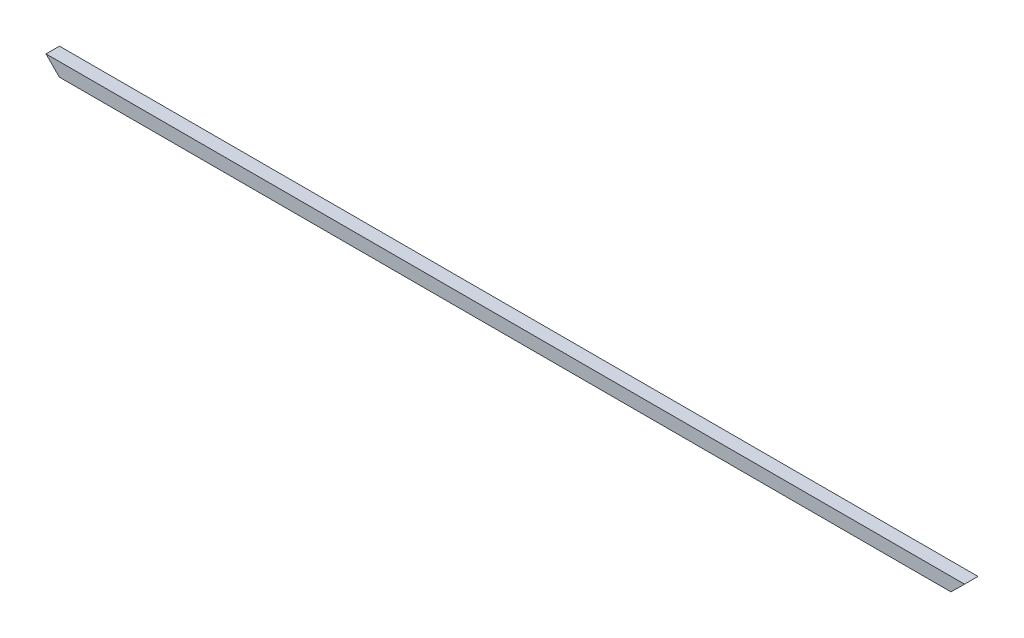
ISO-10303-21;
HEADER;
FILE_DESCRIPTION(('STEP AP214'),'2;1');
FILE_NAME('part.step','',(''),(''),'','','');
FILE_SCHEMA(('AUTOMOTIVE_DESIGN { 1 0 10303 214 1 1 1 1 }'));
ENDSEC;
DATA;
#1=APPLICATION_CONTEXT('core data for automotive mechanical design processes');
#2=APPLICATION_PROTOCOL_DEFINITION('international standard','automotive_design',2000,#1);
#3=PRODUCT_CONTEXT('',#1,'mechanical');
#4=PRODUCT('Part','Part','',(#3));
#5=PRODUCT_RELATED_PRODUCT_CATEGORY('part','',(#4));
#6=PRODUCT_DEFINITION_FORMATION('','',#4);
#7=PRODUCT_DEFINITION_CONTEXT('part definition',#1,'design');
#8=PRODUCT_DEFINITION('design','',#6,#7);
#9=PRODUCT_DEFINITION_SHAPE('','',#8);
#10=(LENGTH_UNIT() NAMED_UNIT(*) SI_UNIT(.MILLI.,.METRE.));
#11=(NAMED_UNIT(*) PLANE_ANGLE_UNIT() SI_UNIT($,.RADIAN.));
#12=(NAMED_UNIT(*) SI_UNIT($,.STERADIAN.) SOLID_ANGLE_UNIT());
#13=UNCERTAINTY_MEASURE_WITH_UNIT(LENGTH_MEASURE(1.E-05),#10,'distance_accuracy_value','');
#14=(GEOMETRIC_REPRESENTATION_CONTEXT(3) GLOBAL_UNCERTAINTY_ASSIGNED_CONTEXT((#13)) GLOBAL_UNIT_ASSIGNED_CONTEXT((#10,
#11,#12)) REPRESENTATION_CONTEXT('',''));
#15=CARTESIAN_POINT('',(0.,0.,0.));
#16=DIRECTION('',(0.,0.,1.));
#17=DIRECTION('',(1.,0.,0.));
#18=AXIS2_PLACEMENT_3D('',#15,#16,#17);
#19=CARTESIAN_POINT('',(-2666.237444967,-40.0000000000003,40.));
#20=DIRECTION('',(0.710799473872985,0.703394702810512,0.));
#21=DIRECTION('',(-0.703394702810512,0.710799473872985,0.));
#22=AXIS2_PLACEMENT_3D('',#19,#20,#21);
#23=PLANE('',#22);
#24=DIRECTION('',(0.703394702810512,-0.710799473872985,0.));
#25=VECTOR('',#24,1.);
#26=CARTESIAN_POINT('',(-2666.237444967,-40.0000000000003,0.));
#27=LINE('',#26,#25);
#28=CARTESIAN_POINT('',(-2705.82074397976,0.,0.));
#29=VERTEX_POINT('',#28);
#30=CARTESIAN_POINT('',(-2666.237444967,-40.0000000000003,0.));
#31=VERTEX_POINT('',#30);
#32=EDGE_CURVE('E99',#29,#31,#27,.T.);
#33=ORIENTED_EDGE('',*,*,#32,.T.);
#34=DIRECTION('',(0.,0.,-1.));
#35=VECTOR('',#34,1.);
#36=CARTESIAN_POINT('',(-2666.237444967,-40.0000000000003,40.));
#37=LINE('',#36,#35);
#38=CARTESIAN_POINT('',(-2666.237444967,-40.0000000000003,40.));
#39=VERTEX_POINT('',#38);
#40=EDGE_CURVE('E11',#39,#31,#37,.T.);
#41=ORIENTED_EDGE('',*,*,#40,.F.);
#42=DIRECTION('',(0.703394702810512,-0.710799473872985,0.));
#43=VECTOR('',#42,1.);
#44=CARTESIAN_POINT('',(-2666.237444967,-40.0000000000003,40.));
#45=LINE('',#44,#43);
#46=CARTESIAN_POINT('',(-2705.82074397976,0.,40.));
#47=VERTEX_POINT('',#46);
#48=EDGE_CURVE('E87',#47,#39,#45,.T.);
#49=ORIENTED_EDGE('',*,*,#48,.F.);
#50=DIRECTION('',(0.,0.,-1.));
#51=VECTOR('',#50,1.);
#52=CARTESIAN_POINT('',(-2705.82074397976,0.,40.));
#53=LINE('',#52,#51);
#54=EDGE_CURVE('E95',#47,#29,#53,.T.);
#55=ORIENTED_EDGE('',*,*,#54,.T.);
#56=EDGE_LOOP('',(#33,#41,#49,#55));
#57=FACE_BOUND('',#56,.T.);
#58=ADVANCED_FACE('F36',(#57),#23,.F.);
#59=CARTESIAN_POINT('',(-16.7718316582911,-40.,40.));
#60=DIRECTION('',(0.,1.,0.));
#61=DIRECTION('',(-1.,0.,0.));
#62=AXIS2_PLACEMENT_3D('',#59,#60,#61);
#63=PLANE('',#62);
#64=DIRECTION('',(1.,0.,0.));
#65=VECTOR('',#64,1.);
#66=CARTESIAN_POINT('',(-16.7718316582911,-40.,0.));
#67=LINE('',#66,#65);
#68=CARTESIAN_POINT('',(-16.7718316582911,-40.,0.));
#69=VERTEX_POINT('',#68);
#70=EDGE_CURVE('E91',#31,#69,#67,.T.);
#71=ORIENTED_EDGE('',*,*,#70,.T.);
#72=DIRECTION('',(0.,0.,-1.));
#73=VECTOR('',#72,1.);
#74=CARTESIAN_POINT('',(-16.7718316582911,-40.,40.));
#75=LINE('',#74,#73);
#76=CARTESIAN_POINT('',(-16.7718316582911,-40.,40.));
#77=VERTEX_POINT('',#76);
#78=EDGE_CURVE('E44',#77,#69,#75,.T.);
#79=ORIENTED_EDGE('',*,*,#78,.F.);
#80=DIRECTION('',(1.,0.,0.));
#81=VECTOR('',#80,1.);
#82=CARTESIAN_POINT('',(-16.7718316582911,-40.,40.));
#83=LINE('',#82,#81);
#84=EDGE_CURVE('E82',#39,#77,#83,.T.);
#85=ORIENTED_EDGE('',*,*,#84,.F.);
#86=ORIENTED_EDGE('',*,*,#40,.T.);
#87=EDGE_LOOP('',(#71,#79,#85,#86));
#88=FACE_BOUND('',#87,.T.);
#89=ADVANCED_FACE('F90',(#88),#63,.F.);
#90=CARTESIAN_POINT('',(23.6492560202433,0.,40.));
#91=DIRECTION('',(-0.7033947028105,0.710799473872996,0.));
#92=DIRECTION('',(-0.710799473872996,-0.7033947028105,0.));
#93=AXIS2_PLACEMENT_3D('',#90,#91,#92);
#94=PLANE('',#93);
#95=DIRECTION('',(0.710799473872996,0.7033947028105,0.));
#96=VECTOR('',#95,1.);
#97=CARTESIAN_POINT('',(23.6492560202433,0.,0.));
#98=LINE('',#97,#96);
#99=CARTESIAN_POINT('',(23.6492560202433,0.,0.));
#100=VERTEX_POINT('',#99);
#101=EDGE_CURVE('E69',#69,#100,#98,.T.);
#102=ORIENTED_EDGE('',*,*,#101,.T.);
#103=DIRECTION('',(0.,0.,-1.));
#104=VECTOR('',#103,1.);
#105=CARTESIAN_POINT('',(23.6492560202433,0.,40.));
#106=LINE('',#105,#104);
#107=CARTESIAN_POINT('',(23.6492560202433,0.,40.));
#108=VERTEX_POINT('',#107);
#109=EDGE_CURVE('E92',#108,#100,#106,.T.);
#110=ORIENTED_EDGE('',*,*,#109,.F.);
#111=DIRECTION('',(0.710799473872996,0.7033947028105,0.));
#112=VECTOR('',#111,1.);
#113=CARTESIAN_POINT('',(23.6492560202433,0.,40.));
#114=LINE('',#113,#112);
#115=EDGE_CURVE('E85',#77,#108,#114,.T.);
#116=ORIENTED_EDGE('',*,*,#115,.F.);
#117=ORIENTED_EDGE('',*,*,#78,.T.);
#118=EDGE_LOOP('',(#102,#110,#116,#117));
#119=FACE_BOUND('',#118,.T.);
#120=ADVANCED_FACE('F93',(#119),#94,.F.);
#121=CARTESIAN_POINT('',(-2705.82074397976,0.,40.));
#122=DIRECTION('',(0.,-1.,0.));
#123=DIRECTION('',(0.,0.,-1.));
#124=AXIS2_PLACEMENT_3D('',#121,#122,#123);
#125=PLANE('',#124);
#126=DIRECTION('',(-1.,0.,0.));
#127=VECTOR('',#126,1.);
#128=CARTESIAN_POINT('',(-2705.82074397976,0.,0.));
#129=LINE('',#128,#127);
#130=EDGE_CURVE('E75',#100,#29,#129,.T.);
#131=ORIENTED_EDGE('',*,*,#130,.T.);
#132=ORIENTED_EDGE('',*,*,#54,.F.);
#133=DIRECTION('',(-1.,0.,0.));
#134=VECTOR('',#133,1.);
#135=CARTESIAN_POINT('',(-2705.82074397976,0.,40.));
#136=LINE('',#135,#134);
#137=EDGE_CURVE('E52',#108,#47,#136,.T.);
#138=ORIENTED_EDGE('',*,*,#137,.F.);
#139=ORIENTED_EDGE('',*,*,#109,.T.);
#140=EDGE_LOOP('',(#131,#132,#138,#139));
#141=FACE_BOUND('',#140,.T.);
#142=ADVANCED_FACE('F106',(#141),#125,.F.);
#143=CARTESIAN_POINT('',(0.,0.,40.));
#144=DIRECTION('',(0.,0.,1.));
#145=DIRECTION('',(1.,0.,0.));
#146=AXIS2_PLACEMENT_3D('',#143,#144,#145);
#147=PLANE('',#146);
#148=ORIENTED_EDGE('',*,*,#48,.T.);
#149=ORIENTED_EDGE('',*,*,#84,.T.);
#150=ORIENTED_EDGE('',*,*,#115,.T.);
#151=ORIENTED_EDGE('',*,*,#137,.T.);
#152=EDGE_LOOP('',(#148,#149,#150,#151));
#153=FACE_BOUND('',#152,.T.);
#154=ADVANCED_FACE('F83',(#153),#147,.T.);
#155=CARTESIAN_POINT('',(0.,0.,0.));
#156=DIRECTION('',(0.,0.,1.));
#157=DIRECTION('',(1.,0.,0.));
#158=AXIS2_PLACEMENT_3D('',#155,#156,#157);
#159=PLANE('',#158);
#160=ORIENTED_EDGE('',*,*,#32,.F.);
#161=ORIENTED_EDGE('',*,*,#130,.F.);
#162=ORIENTED_EDGE('',*,*,#101,.F.);
#163=ORIENTED_EDGE('',*,*,#70,.F.);
#164=EDGE_LOOP('',(#160,#161,#162,#163));
#165=FACE_BOUND('',#164,.T.);
#166=ADVANCED_FACE('F109',(#165),#159,.F.);
#167=CLOSED_SHELL('',(#58,#89,#120,#142,#154,#166));
#168=MANIFOLD_SOLID_BREP('B2',#167);
#169=ADVANCED_BREP_SHAPE_REPRESENTATION('',(#18,#168),#14);
#170=SHAPE_DEFINITION_REPRESENTATION(#9,#169);
ENDSEC;
END-ISO-10303-21;
